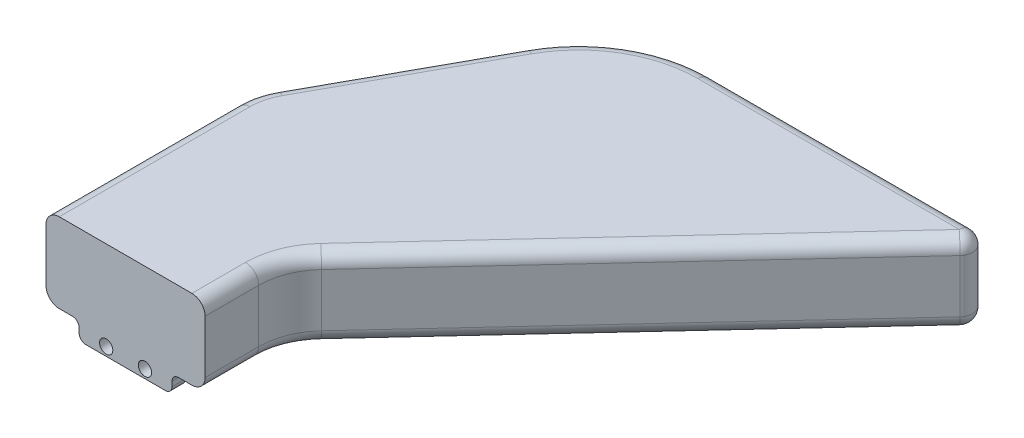
ISO-10303-21;
HEADER;
FILE_DESCRIPTION(('STEP AP214'),'2;1');
FILE_NAME('part.step','',(''),(''),'','','');
FILE_SCHEMA(('AUTOMOTIVE_DESIGN { 1 0 10303 214 1 1 1 1 }'));
ENDSEC;
DATA;
#1=APPLICATION_CONTEXT('core data for automotive mechanical design processes');
#2=APPLICATION_PROTOCOL_DEFINITION('international standard','automotive_design',2000,#1);
#3=PRODUCT_CONTEXT('',#1,'mechanical');
#4=PRODUCT('Part','Part','',(#3));
#5=PRODUCT_RELATED_PRODUCT_CATEGORY('part','',(#4));
#6=PRODUCT_DEFINITION_FORMATION('','',#4);
#7=PRODUCT_DEFINITION_CONTEXT('part definition',#1,'design');
#8=PRODUCT_DEFINITION('design','',#6,#7);
#9=PRODUCT_DEFINITION_SHAPE('','',#8);
#10=(LENGTH_UNIT() NAMED_UNIT(*) SI_UNIT(.MILLI.,.METRE.));
#11=(NAMED_UNIT(*) PLANE_ANGLE_UNIT() SI_UNIT($,.RADIAN.));
#12=(NAMED_UNIT(*) SI_UNIT($,.STERADIAN.) SOLID_ANGLE_UNIT());
#13=UNCERTAINTY_MEASURE_WITH_UNIT(LENGTH_MEASURE(1.E-05),#10,'distance_accuracy_value','');
#14=(GEOMETRIC_REPRESENTATION_CONTEXT(3) GLOBAL_UNCERTAINTY_ASSIGNED_CONTEXT((#13)) GLOBAL_UNIT_ASSIGNED_CONTEXT((#10,
#11,#12)) REPRESENTATION_CONTEXT('',''));
#15=CARTESIAN_POINT('',(0.,0.,0.));
#16=DIRECTION('',(0.,0.,1.));
#17=DIRECTION('',(1.,0.,0.));
#18=AXIS2_PLACEMENT_3D('',#15,#16,#17);
#19=CARTESIAN_POINT('',(-12.,6.,6.));
#20=DIRECTION('',(0.,0.,-1.));
#21=DIRECTION('',(-1.,0.,0.));
#22=AXIS2_PLACEMENT_3D('',#19,#20,#21);
#23=PLANE('',#22);
#24=CARTESIAN_POINT('',(-4.53813912623957,-0.7,6.));
#25=DIRECTION('',(0.,0.,1.));
#26=DIRECTION('',(1.,0.,0.));
#27=AXIS2_PLACEMENT_3D('',#24,#25,#26);
#28=CIRCLE('',#27,0.500000000000001);
#29=CARTESIAN_POINT('',(-4.03813912623957,-0.7,6.));
#30=VERTEX_POINT('',#29);
#31=EDGE_CURVE('E729',#30,#30,#28,.T.);
#32=ORIENTED_EDGE('',*,*,#31,.F.);
#33=EDGE_LOOP('',(#32));
#34=FACE_BOUND('',#33,.T.);
#35=DIRECTION('',(0.,-1.,0.));
#36=VECTOR('',#35,1.);
#37=CARTESIAN_POINT('',(-9.5,0.,6.));
#38=LINE('',#37,#36);
#39=CARTESIAN_POINT('',(-9.5,-0.5,6.));
#40=VERTEX_POINT('',#39);
#41=CARTESIAN_POINT('',(-9.5,-0.85,6.));
#42=VERTEX_POINT('',#41);
#43=EDGE_CURVE('E403',#40,#42,#38,.T.);
#44=ORIENTED_EDGE('',*,*,#43,.T.);
#45=CARTESIAN_POINT('',(-9.,-0.850000000000001,6.));
#46=DIRECTION('',(0.,0.,-1.));
#47=DIRECTION('',(-1.,0.,0.));
#48=AXIS2_PLACEMENT_3D('',#45,#46,#47);
#49=CIRCLE('',#48,0.5);
#50=CARTESIAN_POINT('',(-9.,-1.35,6.));
#51=VERTEX_POINT('',#50);
#52=EDGE_CURVE('E354',#42,#51,#49,.F.);
#53=ORIENTED_EDGE('',*,*,#52,.T.);
#54=DIRECTION('',(1.,0.,0.));
#55=VECTOR('',#54,1.);
#56=CARTESIAN_POINT('',(-9.5,-1.35,6.));
#57=LINE('',#56,#55);
#58=CARTESIAN_POINT('',(-3.,-1.35,6.));
#59=VERTEX_POINT('',#58);
#60=EDGE_CURVE('E410',#51,#59,#57,.T.);
#61=ORIENTED_EDGE('',*,*,#60,.T.);
#62=CARTESIAN_POINT('',(-3.,-0.850000000000001,6.));
#63=DIRECTION('',(0.,0.,-1.));
#64=DIRECTION('',(-1.,0.,0.));
#65=AXIS2_PLACEMENT_3D('',#62,#63,#64);
#66=CIRCLE('',#65,0.5);
#67=CARTESIAN_POINT('',(-2.5,-0.85,6.));
#68=VERTEX_POINT('',#67);
#69=EDGE_CURVE('E352',#59,#68,#66,.F.);
#70=ORIENTED_EDGE('',*,*,#69,.T.);
#71=DIRECTION('',(0.,-1.,0.));
#72=VECTOR('',#71,1.);
#73=CARTESIAN_POINT('',(-2.5,0.,6.));
#74=LINE('',#73,#72);
#75=CARTESIAN_POINT('',(-2.5,-0.5,6.));
#76=VERTEX_POINT('',#75);
#77=EDGE_CURVE('E380',#76,#68,#74,.T.);
#78=ORIENTED_EDGE('',*,*,#77,.F.);
#79=CARTESIAN_POINT('',(-2.,-0.5,6.));
#80=DIRECTION('',(0.,0.,-1.));
#81=DIRECTION('',(-1.,0.,0.));
#82=AXIS2_PLACEMENT_3D('',#79,#80,#81);
#83=CIRCLE('',#82,0.5);
#84=CARTESIAN_POINT('',(-2.,0.,6.));
#85=VERTEX_POINT('',#84);
#86=EDGE_CURVE('E41',#76,#85,#83,.T.);
#87=ORIENTED_EDGE('',*,*,#86,.T.);
#88=DIRECTION('',(1.,0.,0.));
#89=VECTOR('',#88,1.);
#90=CARTESIAN_POINT('',(-12.,0.,6.));
#91=LINE('',#90,#89);
#92=CARTESIAN_POINT('',(-1.,0.,6.));
#93=VERTEX_POINT('',#92);
#94=EDGE_CURVE('E284',#85,#93,#91,.T.);
#95=ORIENTED_EDGE('',*,*,#94,.T.);
#96=CARTESIAN_POINT('',(-1.,1.,6.));
#97=DIRECTION('',(0.,0.,-1.));
#98=DIRECTION('',(-1.,0.,0.));
#99=AXIS2_PLACEMENT_3D('',#96,#97,#98);
#100=CIRCLE('',#99,1.);
#101=CARTESIAN_POINT('',(0.,1.,6.));
#102=VERTEX_POINT('',#101);
#103=EDGE_CURVE('E318',#93,#102,#100,.F.);
#104=ORIENTED_EDGE('',*,*,#103,.T.);
#105=DIRECTION('',(0.,-1.,0.));
#106=VECTOR('',#105,1.);
#107=CARTESIAN_POINT('',(0.,6.,6.));
#108=LINE('',#107,#106);
#109=CARTESIAN_POINT('',(0.,5.,6.));
#110=VERTEX_POINT('',#109);
#111=EDGE_CURVE('E430',#110,#102,#108,.T.);
#112=ORIENTED_EDGE('',*,*,#111,.F.);
#113=CARTESIAN_POINT('',(-1.,5.,6.));
#114=DIRECTION('',(0.,0.,-1.));
#115=DIRECTION('',(-1.,0.,0.));
#116=AXIS2_PLACEMENT_3D('',#113,#114,#115);
#117=CIRCLE('',#116,1.);
#118=CARTESIAN_POINT('',(-1.,6.,6.));
#119=VERTEX_POINT('',#118);
#120=EDGE_CURVE('E231',#110,#119,#117,.F.);
#121=ORIENTED_EDGE('',*,*,#120,.T.);
#122=DIRECTION('',(1.,0.,0.));
#123=VECTOR('',#122,1.);
#124=CARTESIAN_POINT('',(-12.,6.,6.));
#125=LINE('',#124,#123);
#126=CARTESIAN_POINT('',(-11.,6.,6.));
#127=VERTEX_POINT('',#126);
#128=EDGE_CURVE('E213',#127,#119,#125,.T.);
#129=ORIENTED_EDGE('',*,*,#128,.F.);
#130=CARTESIAN_POINT('',(-11.,5.,6.));
#131=DIRECTION('',(0.,0.,-1.));
#132=DIRECTION('',(-1.,0.,0.));
#133=AXIS2_PLACEMENT_3D('',#130,#131,#132);
#134=CIRCLE('',#133,1.);
#135=CARTESIAN_POINT('',(-12.,5.,6.));
#136=VERTEX_POINT('',#135);
#137=EDGE_CURVE('E227',#127,#136,#134,.F.);
#138=ORIENTED_EDGE('',*,*,#137,.T.);
#139=DIRECTION('',(0.,-1.,0.));
#140=VECTOR('',#139,1.);
#141=CARTESIAN_POINT('',(-12.,6.,6.));
#142=LINE('',#141,#140);
#143=CARTESIAN_POINT('',(-12.,1.,6.));
#144=VERTEX_POINT('',#143);
#145=EDGE_CURVE('E433',#136,#144,#142,.T.);
#146=ORIENTED_EDGE('',*,*,#145,.T.);
#147=CARTESIAN_POINT('',(-11.,1.,6.));
#148=DIRECTION('',(0.,0.,-1.));
#149=DIRECTION('',(-1.,0.,0.));
#150=AXIS2_PLACEMENT_3D('',#147,#148,#149);
#151=CIRCLE('',#150,1.);
#152=CARTESIAN_POINT('',(-11.,0.,6.));
#153=VERTEX_POINT('',#152);
#154=EDGE_CURVE('E320',#144,#153,#151,.F.);
#155=ORIENTED_EDGE('',*,*,#154,.T.);
#156=CARTESIAN_POINT('',(-10.,0.,6.));
#157=VERTEX_POINT('',#156);
#158=EDGE_CURVE('E233',#153,#157,#91,.T.);
#159=ORIENTED_EDGE('',*,*,#158,.T.);
#160=CARTESIAN_POINT('',(-10.,-0.5,6.));
#161=DIRECTION('',(0.,0.,-1.));
#162=DIRECTION('',(-1.,0.,0.));
#163=AXIS2_PLACEMENT_3D('',#160,#161,#162);
#164=CIRCLE('',#163,0.5);
#165=EDGE_CURVE('E374',#157,#40,#164,.T.);
#166=ORIENTED_EDGE('',*,*,#165,.T.);
#167=EDGE_LOOP('',(#44,#53,#61,#70,#78,#87,#95,#104,#112,#121,#129,#138,#146,#155,#159,#166));
#168=FACE_BOUND('',#167,.T.);
#169=CARTESIAN_POINT('',(-7.46186087376043,-0.7,6.));
#170=DIRECTION('',(0.,0.,-1.));
#171=DIRECTION('',(-1.,0.,0.));
#172=AXIS2_PLACEMENT_3D('',#169,#170,#171);
#173=CIRCLE('',#172,0.500000000000001);
#174=CARTESIAN_POINT('',(-7.96186087376043,-0.7,6.));
#175=VERTEX_POINT('',#174);
#176=EDGE_CURVE('E730',#175,#175,#173,.T.);
#177=ORIENTED_EDGE('',*,*,#176,.T.);
#178=EDGE_LOOP('',(#177));
#179=FACE_BOUND('',#178,.T.);
#180=ADVANCED_FACE('F33',(#34,#168,#179),#23,.F.);
#181=CARTESIAN_POINT('',(0.,0.,5.));
#182=DIRECTION('',(0.,0.,-1.));
#183=DIRECTION('',(-1.,0.,0.));
#184=AXIS2_PLACEMENT_3D('',#181,#182,#183);
#185=PLANE('',#184);
#186=CARTESIAN_POINT('',(-4.53813912623957,-0.7,5.));
#187=DIRECTION('',(0.,0.,1.));
#188=DIRECTION('',(1.,0.,0.));
#189=AXIS2_PLACEMENT_3D('',#186,#187,#188);
#190=CIRCLE('',#189,0.500000000000001);
#191=CARTESIAN_POINT('',(-4.03813912623957,-0.7,5.));
#192=VERTEX_POINT('',#191);
#193=EDGE_CURVE('E727',#192,#192,#190,.T.);
#194=ORIENTED_EDGE('',*,*,#193,.T.);
#195=EDGE_LOOP('',(#194));
#196=FACE_BOUND('',#195,.T.);
#197=DIRECTION('',(1.,0.,0.));
#198=VECTOR('',#197,1.);
#199=CARTESIAN_POINT('',(-9.5,-1.35,5.));
#200=LINE('',#199,#198);
#201=CARTESIAN_POINT('',(-9.,-1.35,5.));
#202=VERTEX_POINT('',#201);
#203=CARTESIAN_POINT('',(-3.,-1.35,5.));
#204=VERTEX_POINT('',#203);
#205=EDGE_CURVE('E399',#202,#204,#200,.T.);
#206=ORIENTED_EDGE('',*,*,#205,.F.);
#207=CARTESIAN_POINT('',(-9.,-0.850000000000001,5.));
#208=DIRECTION('',(0.,0.,-1.));
#209=DIRECTION('',(-1.,0.,0.));
#210=AXIS2_PLACEMENT_3D('',#207,#208,#209);
#211=CIRCLE('',#210,0.5);
#212=CARTESIAN_POINT('',(-9.5,-0.85,5.));
#213=VERTEX_POINT('',#212);
#214=EDGE_CURVE('E363',#202,#213,#211,.T.);
#215=ORIENTED_EDGE('',*,*,#214,.T.);
#216=DIRECTION('',(0.,-1.,0.));
#217=VECTOR('',#216,1.);
#218=CARTESIAN_POINT('',(-9.5,0.,5.));
#219=LINE('',#218,#217);
#220=CARTESIAN_POINT('',(-9.5,-0.5,5.));
#221=VERTEX_POINT('',#220);
#222=EDGE_CURVE('E328',#221,#213,#219,.T.);
#223=ORIENTED_EDGE('',*,*,#222,.F.);
#224=CARTESIAN_POINT('',(-10.,-0.5,5.));
#225=DIRECTION('',(0.,0.,-1.));
#226=DIRECTION('',(-1.,0.,0.));
#227=AXIS2_PLACEMENT_3D('',#224,#225,#226);
#228=CIRCLE('',#227,0.5);
#229=CARTESIAN_POINT('',(-10.,0.,5.));
#230=VERTEX_POINT('',#229);
#231=EDGE_CURVE('E376',#221,#230,#228,.F.);
#232=ORIENTED_EDGE('',*,*,#231,.T.);
#233=DIRECTION('',(1.,0.,0.));
#234=VECTOR('',#233,1.);
#235=CARTESIAN_POINT('',(-9.5,0.,5.));
#236=LINE('',#235,#234);
#237=CARTESIAN_POINT('',(-2.,0.,5.));
#238=VERTEX_POINT('',#237);
#239=EDGE_CURVE('E48',#230,#238,#236,.T.);
#240=ORIENTED_EDGE('',*,*,#239,.T.);
#241=CARTESIAN_POINT('',(-2.,-0.5,5.));
#242=DIRECTION('',(0.,0.,-1.));
#243=DIRECTION('',(-1.,0.,0.));
#244=AXIS2_PLACEMENT_3D('',#241,#242,#243);
#245=CIRCLE('',#244,0.5);
#246=CARTESIAN_POINT('',(-2.5,-0.5,5.));
#247=VERTEX_POINT('',#246);
#248=EDGE_CURVE('E11',#238,#247,#245,.F.);
#249=ORIENTED_EDGE('',*,*,#248,.T.);
#250=DIRECTION('',(0.,-1.,0.));
#251=VECTOR('',#250,1.);
#252=CARTESIAN_POINT('',(-2.5,0.,5.));
#253=LINE('',#252,#251);
#254=CARTESIAN_POINT('',(-2.5,-0.85,5.));
#255=VERTEX_POINT('',#254);
#256=EDGE_CURVE('E394',#247,#255,#253,.T.);
#257=ORIENTED_EDGE('',*,*,#256,.T.);
#258=CARTESIAN_POINT('',(-3.,-0.850000000000001,5.));
#259=DIRECTION('',(0.,0.,-1.));
#260=DIRECTION('',(-1.,0.,0.));
#261=AXIS2_PLACEMENT_3D('',#258,#259,#260);
#262=CIRCLE('',#261,0.5);
#263=EDGE_CURVE('E361',#255,#204,#262,.T.);
#264=ORIENTED_EDGE('',*,*,#263,.T.);
#265=EDGE_LOOP('',(#206,#215,#223,#232,#240,#249,#257,#264));
#266=FACE_BOUND('',#265,.T.);
#267=CARTESIAN_POINT('',(-7.46186087376043,-0.7,5.));
#268=DIRECTION('',(0.,0.,-1.));
#269=DIRECTION('',(-1.,0.,0.));
#270=AXIS2_PLACEMENT_3D('',#267,#268,#269);
#271=CIRCLE('',#270,0.500000000000001);
#272=CARTESIAN_POINT('',(-7.96186087376043,-0.7,5.));
#273=VERTEX_POINT('',#272);
#274=EDGE_CURVE('E411',#273,#273,#271,.T.);
#275=ORIENTED_EDGE('',*,*,#274,.F.);
#276=EDGE_LOOP('',(#275));
#277=FACE_BOUND('',#276,.T.);
#278=ADVANCED_FACE('F392',(#196,#266,#277),#185,.T.);
#279=CARTESIAN_POINT('',(4.05099434095391,0.,-18.1082033154485));
#280=DIRECTION('',(0.,1.,0.));
#281=DIRECTION('',(0.,0.,1.));
#282=AXIS2_PLACEMENT_3D('',#279,#280,#281);
#283=PLANE('',#282);
#284=ORIENTED_EDGE('',*,*,#239,.F.);
#285=DIRECTION('',(0.,0.,1.));
#286=VECTOR('',#285,1.);
#287=CARTESIAN_POINT('',(-10.,0.,-18.1082033154485));
#288=LINE('',#287,#286);
#289=EDGE_CURVE('E367',#230,#157,#288,.T.);
#290=ORIENTED_EDGE('',*,*,#289,.T.);
#291=ORIENTED_EDGE('',*,*,#158,.F.);
#292=DIRECTION('',(0.,0.,1.));
#293=VECTOR('',#292,1.);
#294=CARTESIAN_POINT('',(-11.,0.,-18.1082033154485));
#295=LINE('',#294,#293);
#296=CARTESIAN_POINT('',(-11.,0.,-8.38318146131155));
#297=VERTEX_POINT('',#296);
#298=EDGE_CURVE('E302',#153,#297,#295,.F.);
#299=ORIENTED_EDGE('',*,*,#298,.T.);
#300=CARTESIAN_POINT('',(-7.,0.,-8.38318146131155));
#301=DIRECTION('',(0.,1.,0.));
#302=DIRECTION('',(0.,0.,1.));
#303=AXIS2_PLACEMENT_3D('',#300,#301,#302);
#304=CIRCLE('',#303,4.);
#305=CARTESIAN_POINT('',(-10.5053665625822,0.,-10.3099417634588));
#306=VERTEX_POINT('',#305);
#307=EDGE_CURVE('E300',#297,#306,#304,.F.);
#308=ORIENTED_EDGE('',*,*,#307,.T.);
#309=DIRECTION('',(-0.481690075536806,0.,0.876341640645557));
#310=VECTOR('',#309,1.);
#311=CARTESIAN_POINT('',(-3.83608042485611,0.,-22.4434139952798));
#312=LINE('',#311,#310);
#313=CARTESIAN_POINT('',(-3.83608042485611,0.,-22.4434139952797));
#314=VERTEX_POINT('',#313);
#315=EDGE_CURVE('E298',#306,#314,#312,.F.);
#316=ORIENTED_EDGE('',*,*,#315,.T.);
#317=CARTESIAN_POINT('',(4.05099434095391,0.,-18.1082033154485));
#318=DIRECTION('',(0.,1.,0.));
#319=DIRECTION('',(0.,0.,1.));
#320=AXIS2_PLACEMENT_3D('',#317,#318,#319);
#321=CIRCLE('',#320,9.);
#322=CARTESIAN_POINT('',(4.05099434095391,0.,-27.1082033154485));
#323=VERTEX_POINT('',#322);
#324=EDGE_CURVE('E296',#314,#323,#321,.F.);
#325=ORIENTED_EDGE('',*,*,#324,.T.);
#326=DIRECTION('',(-1.,0.,0.));
#327=VECTOR('',#326,1.);
#328=CARTESIAN_POINT('',(4.0509943409539,0.,-27.1082033154485));
#329=LINE('',#328,#327);
#330=CARTESIAN_POINT('',(23.7653269040619,0.,-27.1082033154485));
#331=VERTEX_POINT('',#330);
#332=EDGE_CURVE('E294',#323,#331,#329,.F.);
#333=ORIENTED_EDGE('',*,*,#332,.T.);
#334=DIRECTION('',(0.679825964067101,0.,-0.733373478236182));
#335=VECTOR('',#334,1.);
#336=CARTESIAN_POINT('',(10.166988106067,0.,-12.4387709171073));
#337=LINE('',#336,#335);
#338=CARTESIAN_POINT('',(0.59975913058292,0.,-2.11796476716707));
#339=VERTEX_POINT('',#338);
#340=EDGE_CURVE('E292',#331,#339,#337,.F.);
#341=ORIENTED_EDGE('',*,*,#340,.T.);
#342=CARTESIAN_POINT('',(5.,0.,1.96099101723556));
#343=DIRECTION('',(0.,1.,0.));
#344=DIRECTION('',(0.,0.,1.));
#345=AXIS2_PLACEMENT_3D('',#342,#343,#344);
#346=CIRCLE('',#345,6.);
#347=CARTESIAN_POINT('',(-1.,0.,1.96099101723558));
#348=VERTEX_POINT('',#347);
#349=EDGE_CURVE('E290',#339,#348,#346,.T.);
#350=ORIENTED_EDGE('',*,*,#349,.T.);
#351=DIRECTION('',(0.,0.,-1.));
#352=VECTOR('',#351,1.);
#353=CARTESIAN_POINT('',(-1.,0.,-18.1082033154485));
#354=LINE('',#353,#352);
#355=EDGE_CURVE('E287',#348,#93,#354,.F.);
#356=ORIENTED_EDGE('',*,*,#355,.T.);
#357=ORIENTED_EDGE('',*,*,#94,.F.);
#358=DIRECTION('',(0.,0.,1.));
#359=VECTOR('',#358,1.);
#360=CARTESIAN_POINT('',(-2.,0.,5.));
#361=LINE('',#360,#359);
#362=EDGE_CURVE('E365',#85,#238,#361,.F.);
#363=ORIENTED_EDGE('',*,*,#362,.T.);
#364=EDGE_LOOP('',(#284,#290,#291,#299,#308,#316,#325,#333,#341,#350,#356,#357,#363));
#365=FACE_BOUND('',#364,.T.);
#366=ADVANCED_FACE('F384',(#365),#283,.F.);
#367=CARTESIAN_POINT('',(4.05099434095391,6.,-18.1082033154485));
#368=DIRECTION('',(0.,-1.,0.));
#369=DIRECTION('',(0.,0.,-1.));
#370=AXIS2_PLACEMENT_3D('',#367,#368,#369);
#371=CYLINDRICAL_SURFACE('',#370,10.);
#372=DIRECTION('',(0.,-1.,0.));
#373=VECTOR('',#372,1.);
#374=CARTESIAN_POINT('',(4.05099434095391,6.,-28.1082033154485));
#375=LINE('',#374,#373);
#376=CARTESIAN_POINT('',(4.05099434095391,5.,-28.1082033154485));
#377=VERTEX_POINT('',#376);
#378=CARTESIAN_POINT('',(4.05099434095391,1.,-28.1082033154485));
#379=VERTEX_POINT('',#378);
#380=EDGE_CURVE('E232',#377,#379,#375,.T.);
#381=ORIENTED_EDGE('',*,*,#380,.T.);
#382=CARTESIAN_POINT('',(4.05099434095391,1.,-18.1082033154485));
#383=DIRECTION('',(0.,1.,0.));
#384=DIRECTION('',(0.,0.,1.));
#385=AXIS2_PLACEMENT_3D('',#382,#383,#384);
#386=CIRCLE('',#385,10.);
#387=CARTESIAN_POINT('',(-4.71242206550166,1.,-22.9251040708166));
#388=VERTEX_POINT('',#387);
#389=EDGE_CURVE('E306',#379,#388,#386,.T.);
#390=ORIENTED_EDGE('',*,*,#389,.T.);
#391=DIRECTION('',(0.,-1.,0.));
#392=VECTOR('',#391,1.);
#393=CARTESIAN_POINT('',(-4.71242206550166,6.,-22.9251040708166));
#394=LINE('',#393,#392);
#395=CARTESIAN_POINT('',(-4.71242206550166,5.,-22.9251040708166));
#396=VERTEX_POINT('',#395);
#397=EDGE_CURVE('E221',#396,#388,#394,.T.);
#398=ORIENTED_EDGE('',*,*,#397,.F.);
#399=CARTESIAN_POINT('',(4.05099434095391,5.,-18.1082033154485));
#400=DIRECTION('',(0.,1.,0.));
#401=DIRECTION('',(0.,0.,1.));
#402=AXIS2_PLACEMENT_3D('',#399,#400,#401);
#403=CIRCLE('',#402,10.);
#404=EDGE_CURVE('E253',#396,#377,#403,.F.);
#405=ORIENTED_EDGE('',*,*,#404,.T.);
#406=EDGE_LOOP('',(#381,#390,#398,#405));
#407=FACE_BOUND('',#406,.T.);
#408=ADVANCED_FACE('F584',(#407),#371,.T.);
#409=CARTESIAN_POINT('',(-11.3817082032278,6.,-10.7916318389956));
#410=DIRECTION('',(0.876341640645557,0.,0.481690075536806));
#411=DIRECTION('',(0.481690075536806,0.,-0.876341640645557));
#412=AXIS2_PLACEMENT_3D('',#409,#410,#411);
#413=PLANE('',#412);
#414=ORIENTED_EDGE('',*,*,#397,.T.);
#415=DIRECTION('',(-0.481690075536806,0.,0.876341640645557));
#416=VECTOR('',#415,1.);
#417=CARTESIAN_POINT('',(-11.3817082032278,1.,-10.7916318389956));
#418=LINE('',#417,#416);
#419=CARTESIAN_POINT('',(-11.3817082032278,1.,-10.7916318389956));
#420=VERTEX_POINT('',#419);
#421=EDGE_CURVE('E304',#388,#420,#418,.T.);
#422=ORIENTED_EDGE('',*,*,#421,.T.);
#423=DIRECTION('',(0.,-1.,0.));
#424=VECTOR('',#423,1.);
#425=CARTESIAN_POINT('',(-11.3817082032278,6.,-10.7916318389956));
#426=LINE('',#425,#424);
#427=CARTESIAN_POINT('',(-11.3817082032278,5.,-10.7916318389956));
#428=VERTEX_POINT('',#427);
#429=EDGE_CURVE('E438',#428,#420,#426,.T.);
#430=ORIENTED_EDGE('',*,*,#429,.F.);
#431=DIRECTION('',(-0.481690075536806,0.,0.876341640645557));
#432=VECTOR('',#431,1.);
#433=CARTESIAN_POINT('',(-4.71242206550166,5.,-22.9251040708166));
#434=LINE('',#433,#432);
#435=EDGE_CURVE('E255',#428,#396,#434,.F.);
#436=ORIENTED_EDGE('',*,*,#435,.T.);
#437=EDGE_LOOP('',(#414,#422,#430,#436));
#438=FACE_BOUND('',#437,.T.);
#439=ADVANCED_FACE('F518',(#438),#413,.F.);
#440=CARTESIAN_POINT('',(-7.,6.,-8.38318146131155));
#441=DIRECTION('',(0.,-1.,0.));
#442=DIRECTION('',(0.,0.,-1.));
#443=AXIS2_PLACEMENT_3D('',#440,#441,#442);
#444=CYLINDRICAL_SURFACE('',#443,5.);
#445=ORIENTED_EDGE('',*,*,#429,.T.);
#446=CARTESIAN_POINT('',(-7.,1.,-8.38318146131155));
#447=DIRECTION('',(0.,1.,0.));
#448=DIRECTION('',(0.,0.,1.));
#449=AXIS2_PLACEMENT_3D('',#446,#447,#448);
#450=CIRCLE('',#449,5.);
#451=CARTESIAN_POINT('',(-12.,1.,-8.38318146131155));
#452=VERTEX_POINT('',#451);
#453=EDGE_CURVE('E260',#420,#452,#450,.T.);
#454=ORIENTED_EDGE('',*,*,#453,.T.);
#455=DIRECTION('',(0.,-1.,0.));
#456=VECTOR('',#455,1.);
#457=CARTESIAN_POINT('',(-12.,6.,-8.38318146131155));
#458=LINE('',#457,#456);
#459=CARTESIAN_POINT('',(-12.,5.,-8.38318146131155));
#460=VERTEX_POINT('',#459);
#461=EDGE_CURVE('E435',#460,#452,#458,.T.);
#462=ORIENTED_EDGE('',*,*,#461,.F.);
#463=CARTESIAN_POINT('',(-7.,5.,-8.38318146131155));
#464=DIRECTION('',(0.,1.,0.));
#465=DIRECTION('',(0.,0.,1.));
#466=AXIS2_PLACEMENT_3D('',#463,#464,#465);
#467=CIRCLE('',#466,5.);
#468=EDGE_CURVE('E257',#460,#428,#467,.F.);
#469=ORIENTED_EDGE('',*,*,#468,.T.);
#470=EDGE_LOOP('',(#445,#454,#462,#469));
#471=FACE_BOUND('',#470,.T.);
#472=ADVANCED_FACE('F515',(#471),#444,.T.);
#473=CARTESIAN_POINT('',(-12.,6.,-8.38318146131155));
#474=DIRECTION('',(1.,0.,0.));
#475=DIRECTION('',(0.,0.,-1.));
#476=AXIS2_PLACEMENT_3D('',#473,#474,#475);
#477=PLANE('',#476);
#478=ORIENTED_EDGE('',*,*,#461,.T.);
#479=DIRECTION('',(0.,0.,1.));
#480=VECTOR('',#479,1.);
#481=CARTESIAN_POINT('',(-12.,1.,-8.38318146131155));
#482=LINE('',#481,#480);
#483=EDGE_CURVE('E316',#452,#144,#482,.T.);
#484=ORIENTED_EDGE('',*,*,#483,.T.);
#485=ORIENTED_EDGE('',*,*,#145,.F.);
#486=DIRECTION('',(0.,0.,1.));
#487=VECTOR('',#486,1.);
#488=CARTESIAN_POINT('',(-12.,5.,-8.38318146131155));
#489=LINE('',#488,#487);
#490=EDGE_CURVE('E237',#136,#460,#489,.F.);
#491=ORIENTED_EDGE('',*,*,#490,.T.);
#492=EDGE_LOOP('',(#478,#484,#485,#491));
#493=FACE_BOUND('',#492,.T.);
#494=ADVANCED_FACE('F532',(#493),#477,.F.);
#495=CARTESIAN_POINT('',(0.,6.,6.));
#496=DIRECTION('',(-1.,0.,0.));
#497=DIRECTION('',(0.,0.,1.));
#498=AXIS2_PLACEMENT_3D('',#495,#496,#497);
#499=PLANE('',#498);
#500=ORIENTED_EDGE('',*,*,#111,.T.);
#501=DIRECTION('',(0.,0.,-1.));
#502=VECTOR('',#501,1.);
#503=CARTESIAN_POINT('',(0.,1.,6.));
#504=LINE('',#503,#502);
#505=CARTESIAN_POINT('',(0.,1.,1.96099101723557));
#506=VERTEX_POINT('',#505);
#507=EDGE_CURVE('E322',#102,#506,#504,.T.);
#508=ORIENTED_EDGE('',*,*,#507,.T.);
#509=DIRECTION('',(0.,-1.,0.));
#510=VECTOR('',#509,1.);
#511=CARTESIAN_POINT('',(0.,6.,1.96099101723557));
#512=LINE('',#511,#510);
#513=CARTESIAN_POINT('',(0.,5.,1.96099101723557));
#514=VERTEX_POINT('',#513);
#515=EDGE_CURVE('E427',#514,#506,#512,.T.);
#516=ORIENTED_EDGE('',*,*,#515,.F.);
#517=DIRECTION('',(0.,0.,-1.));
#518=VECTOR('',#517,1.);
#519=CARTESIAN_POINT('',(0.,5.,6.));
#520=LINE('',#519,#518);
#521=EDGE_CURVE('E238',#514,#110,#520,.F.);
#522=ORIENTED_EDGE('',*,*,#521,.T.);
#523=EDGE_LOOP('',(#500,#508,#516,#522));
#524=FACE_BOUND('',#523,.T.);
#525=ADVANCED_FACE('F576',(#524),#499,.F.);
#526=CARTESIAN_POINT('',(5.,6.,1.96099101723556));
#527=DIRECTION('',(0.,-1.,0.));
#528=DIRECTION('',(0.,0.,-1.));
#529=AXIS2_PLACEMENT_3D('',#526,#527,#528);
#530=CYLINDRICAL_SURFACE('',#529,5.);
#531=ORIENTED_EDGE('',*,*,#515,.T.);
#532=CARTESIAN_POINT('',(5.,1.,1.96099101723556));
#533=DIRECTION('',(0.,1.,0.));
#534=DIRECTION('',(0.,0.,1.));
#535=AXIS2_PLACEMENT_3D('',#532,#533,#534);
#536=CIRCLE('',#535,5.);
#537=CARTESIAN_POINT('',(1.3331326088191,1.,-1.43813880309996));
#538=VERTEX_POINT('',#537);
#539=EDGE_CURVE('E314',#506,#538,#536,.F.);
#540=ORIENTED_EDGE('',*,*,#539,.T.);
#541=DIRECTION('',(0.,-1.,0.));
#542=VECTOR('',#541,1.);
#543=CARTESIAN_POINT('',(1.3331326088191,6.,-1.43813880309996));
#544=LINE('',#543,#542);
#545=CARTESIAN_POINT('',(1.3331326088191,5.,-1.43813880309996));
#546=VERTEX_POINT('',#545);
#547=EDGE_CURVE('E424',#546,#538,#544,.T.);
#548=ORIENTED_EDGE('',*,*,#547,.F.);
#549=CARTESIAN_POINT('',(5.,5.,1.96099101723556));
#550=DIRECTION('',(0.,1.,0.));
#551=DIRECTION('',(0.,0.,1.));
#552=AXIS2_PLACEMENT_3D('',#549,#550,#551);
#553=CIRCLE('',#552,5.);
#554=EDGE_CURVE('E240',#546,#514,#553,.T.);
#555=ORIENTED_EDGE('',*,*,#554,.T.);
#556=EDGE_LOOP('',(#531,#540,#548,#555));
#557=FACE_BOUND('',#556,.T.);
#558=ADVANCED_FACE('F653',(#557),#530,.F.);
#559=CARTESIAN_POINT('',(24.4987003822981,6.,-26.4283773513814));
#560=DIRECTION('',(-0.733373478236182,0.,-0.679825964067101));
#561=DIRECTION('',(-0.679825964067101,0.,0.733373478236182));
#562=AXIS2_PLACEMENT_3D('',#559,#560,#561);
#563=PLANE('',#562);
#564=ORIENTED_EDGE('',*,*,#547,.T.);
#565=DIRECTION('',(0.679825964067101,0.,-0.733373478236182));
#566=VECTOR('',#565,1.);
#567=CARTESIAN_POINT('',(24.4987003822981,1.,-26.4283773513814));
#568=LINE('',#567,#566);
#569=CARTESIAN_POINT('',(24.4987003822981,1.,-26.4283773513814));
#570=VERTEX_POINT('',#569);
#571=EDGE_CURVE('E312',#538,#570,#568,.T.);
#572=ORIENTED_EDGE('',*,*,#571,.T.);
#573=DIRECTION('',(0.,-1.,0.));
#574=VECTOR('',#573,1.);
#575=CARTESIAN_POINT('',(24.4987003822981,6.,-26.4283773513814));
#576=LINE('',#575,#574);
#577=CARTESIAN_POINT('',(24.4987003822981,5.,-26.4283773513814));
#578=VERTEX_POINT('',#577);
#579=EDGE_CURVE('E421',#578,#570,#576,.T.);
#580=ORIENTED_EDGE('',*,*,#579,.F.);
#581=DIRECTION('',(0.679825964067101,0.,-0.733373478236182));
#582=VECTOR('',#581,1.);
#583=CARTESIAN_POINT('',(1.33313260881911,5.,-1.43813880309997));
#584=LINE('',#583,#582);
#585=EDGE_CURVE('E247',#578,#546,#584,.F.);
#586=ORIENTED_EDGE('',*,*,#585,.T.);
#587=EDGE_LOOP('',(#564,#572,#580,#586));
#588=FACE_BOUND('',#587,.T.);
#589=ADVANCED_FACE('F483',(#588),#563,.F.);
#590=CARTESIAN_POINT('',(23.7653269040619,6.,-27.1082033154485));
#591=DIRECTION('',(0.,-1.,0.));
#592=DIRECTION('',(0.,0.,-1.));
#593=AXIS2_PLACEMENT_3D('',#590,#591,#592);
#594=CYLINDRICAL_SURFACE('',#593,1.);
#595=ORIENTED_EDGE('',*,*,#579,.T.);
#596=CARTESIAN_POINT('',(23.7653269040619,1.,-27.1082033154485));
#597=DIRECTION('',(0.,-1.,0.));
#598=DIRECTION('',(0.,0.,-1.));
#599=AXIS2_PLACEMENT_3D('',#596,#597,#598);
#600=CIRCLE('',#599,1.);
#601=CARTESIAN_POINT('',(23.7653269040619,1.,-28.1082033154485));
#602=VERTEX_POINT('',#601);
#603=EDGE_CURVE('E310',#570,#602,#600,.F.);
#604=ORIENTED_EDGE('',*,*,#603,.T.);
#605=DIRECTION('',(0.,-1.,0.));
#606=VECTOR('',#605,1.);
#607=CARTESIAN_POINT('',(23.7653269040619,6.,-28.1082033154485));
#608=LINE('',#607,#606);
#609=CARTESIAN_POINT('',(23.7653269040619,5.,-28.1082033154485));
#610=VERTEX_POINT('',#609);
#611=EDGE_CURVE('E418',#610,#602,#608,.T.);
#612=ORIENTED_EDGE('',*,*,#611,.F.);
#613=CARTESIAN_POINT('',(23.7653269040619,5.,-27.1082033154485));
#614=DIRECTION('',(0.,-1.,0.));
#615=DIRECTION('',(0.,0.,-1.));
#616=AXIS2_PLACEMENT_3D('',#613,#614,#615);
#617=CIRCLE('',#616,1.);
#618=EDGE_CURVE('E249',#610,#578,#617,.T.);
#619=ORIENTED_EDGE('',*,*,#618,.T.);
#620=EDGE_LOOP('',(#595,#604,#612,#619));
#621=FACE_BOUND('',#620,.T.);
#622=ADVANCED_FACE('F480',(#621),#594,.T.);
#623=CARTESIAN_POINT('',(4.05099434095391,6.,-28.1082033154485));
#624=DIRECTION('',(0.,0.,1.));
#625=DIRECTION('',(1.,0.,0.));
#626=AXIS2_PLACEMENT_3D('',#623,#624,#625);
#627=PLANE('',#626);
#628=ORIENTED_EDGE('',*,*,#611,.T.);
#629=DIRECTION('',(-1.,0.,0.));
#630=VECTOR('',#629,1.);
#631=CARTESIAN_POINT('',(4.05099434095391,1.,-28.1082033154485));
#632=LINE('',#631,#630);
#633=EDGE_CURVE('E308',#602,#379,#632,.T.);
#634=ORIENTED_EDGE('',*,*,#633,.T.);
#635=ORIENTED_EDGE('',*,*,#380,.F.);
#636=DIRECTION('',(-1.,0.,0.));
#637=VECTOR('',#636,1.);
#638=CARTESIAN_POINT('',(23.7653269040619,5.,-28.1082033154485));
#639=LINE('',#638,#637);
#640=EDGE_CURVE('E251',#377,#610,#639,.F.);
#641=ORIENTED_EDGE('',*,*,#640,.T.);
#642=EDGE_LOOP('',(#628,#634,#635,#641));
#643=FACE_BOUND('',#642,.T.);
#644=ADVANCED_FACE('F496',(#643),#627,.F.);
#645=CARTESIAN_POINT('',(4.05099434095391,6.,-18.1082033154485));
#646=DIRECTION('',(0.,1.,0.));
#647=DIRECTION('',(0.,0.,1.));
#648=AXIS2_PLACEMENT_3D('',#645,#646,#647);
#649=PLANE('',#648);
#650=ORIENTED_EDGE('',*,*,#128,.T.);
#651=DIRECTION('',(0.,0.,-1.));
#652=VECTOR('',#651,1.);
#653=CARTESIAN_POINT('',(-1.,6.,1.96099101723558));
#654=LINE('',#653,#652);
#655=CARTESIAN_POINT('',(-1.,6.,1.96099101723557));
#656=VERTEX_POINT('',#655);
#657=EDGE_CURVE('E242',#119,#656,#654,.T.);
#658=ORIENTED_EDGE('',*,*,#657,.T.);
#659=CARTESIAN_POINT('',(5.,6.,1.96099101723556));
#660=DIRECTION('',(0.,1.,0.));
#661=DIRECTION('',(0.,0.,1.));
#662=AXIS2_PLACEMENT_3D('',#659,#660,#661);
#663=CIRCLE('',#662,6.);
#664=CARTESIAN_POINT('',(0.599759130582923,6.,-2.11796476716707));
#665=VERTEX_POINT('',#664);
#666=EDGE_CURVE('E452',#656,#665,#663,.F.);
#667=ORIENTED_EDGE('',*,*,#666,.T.);
#668=DIRECTION('',(0.679825964067101,0.,-0.733373478236182));
#669=VECTOR('',#668,1.);
#670=CARTESIAN_POINT('',(23.7653269040619,6.,-27.1082033154485));
#671=LINE('',#670,#669);
#672=CARTESIAN_POINT('',(23.7653269040619,6.,-27.1082033154485));
#673=VERTEX_POINT('',#672);
#674=EDGE_CURVE('E450',#665,#673,#671,.T.);
#675=ORIENTED_EDGE('',*,*,#674,.T.);
#676=DIRECTION('',(-1.,0.,0.));
#677=VECTOR('',#676,1.);
#678=CARTESIAN_POINT('',(4.05099434095391,6.,-27.1082033154485));
#679=LINE('',#678,#677);
#680=CARTESIAN_POINT('',(4.05099434095391,6.,-27.1082033154485));
#681=VERTEX_POINT('',#680);
#682=EDGE_CURVE('E448',#673,#681,#679,.T.);
#683=ORIENTED_EDGE('',*,*,#682,.T.);
#684=CARTESIAN_POINT('',(4.05099434095391,6.,-18.1082033154485));
#685=DIRECTION('',(0.,1.,0.));
#686=DIRECTION('',(0.,0.,1.));
#687=AXIS2_PLACEMENT_3D('',#684,#685,#686);
#688=CIRCLE('',#687,9.);
#689=CARTESIAN_POINT('',(-3.83608042485611,6.,-22.4434139952797));
#690=VERTEX_POINT('',#689);
#691=EDGE_CURVE('E446',#681,#690,#688,.T.);
#692=ORIENTED_EDGE('',*,*,#691,.T.);
#693=DIRECTION('',(-0.481690075536806,0.,0.876341640645557));
#694=VECTOR('',#693,1.);
#695=CARTESIAN_POINT('',(-10.5053665625822,6.,-10.3099417634588));
#696=LINE('',#695,#694);
#697=CARTESIAN_POINT('',(-10.5053665625822,6.,-10.3099417634588));
#698=VERTEX_POINT('',#697);
#699=EDGE_CURVE('E444',#690,#698,#696,.T.);
#700=ORIENTED_EDGE('',*,*,#699,.T.);
#701=CARTESIAN_POINT('',(-7.,6.,-8.38318146131155));
#702=DIRECTION('',(0.,1.,0.));
#703=DIRECTION('',(0.,0.,1.));
#704=AXIS2_PLACEMENT_3D('',#701,#702,#703);
#705=CIRCLE('',#704,4.);
#706=CARTESIAN_POINT('',(-11.,6.,-8.38318146131155));
#707=VERTEX_POINT('',#706);
#708=EDGE_CURVE('E216',#698,#707,#705,.T.);
#709=ORIENTED_EDGE('',*,*,#708,.T.);
#710=DIRECTION('',(0.,0.,1.));
#711=VECTOR('',#710,1.);
#712=CARTESIAN_POINT('',(-11.,6.,6.));
#713=LINE('',#712,#711);
#714=EDGE_CURVE('E209',#707,#127,#713,.T.);
#715=ORIENTED_EDGE('',*,*,#714,.T.);
#716=EDGE_LOOP('',(#650,#658,#667,#675,#683,#692,#700,#709,#715));
#717=FACE_BOUND('',#716,.T.);
#718=ADVANCED_FACE('F211',(#717),#649,.T.);
#719=CARTESIAN_POINT('',(-11.,5.,-18.1082033154485));
#720=DIRECTION('',(0.,0.,-1.));
#721=DIRECTION('',(-1.,0.,0.));
#722=AXIS2_PLACEMENT_3D('',#719,#720,#721);
#723=CYLINDRICAL_SURFACE('',#722,1.);
#724=ORIENTED_EDGE('',*,*,#137,.F.);
#725=ORIENTED_EDGE('',*,*,#714,.F.);
#726=CARTESIAN_POINT('',(-11.,5.,-8.38318146131155));
#727=DIRECTION('',(0.,0.,-1.));
#728=DIRECTION('',(-1.,0.,0.));
#729=AXIS2_PLACEMENT_3D('',#726,#727,#728);
#730=CIRCLE('',#729,1.);
#731=EDGE_CURVE('E282',#460,#707,#730,.T.);
#732=ORIENTED_EDGE('',*,*,#731,.F.);
#733=ORIENTED_EDGE('',*,*,#490,.F.);
#734=EDGE_LOOP('',(#724,#725,#732,#733));
#735=FACE_BOUND('',#734,.T.);
#736=ADVANCED_FACE('F236',(#735),#723,.T.);
#737=CARTESIAN_POINT('',(-7.,5.,-8.38318146131155));
#738=DIRECTION('',(0.,1.,0.));
#739=DIRECTION('',(0.,0.,1.));
#740=AXIS2_PLACEMENT_3D('',#737,#738,#739);
#741=TOROIDAL_SURFACE('',#740,4.,1.);
#742=ORIENTED_EDGE('',*,*,#731,.T.);
#743=ORIENTED_EDGE('',*,*,#708,.F.);
#744=CARTESIAN_POINT('',(-10.5053665625822,5.,-10.3099417634588));
#745=DIRECTION('',(0.481690075536806,0.,-0.876341640645557));
#746=DIRECTION('',(-0.876341640645557,0.,-0.481690075536806));
#747=AXIS2_PLACEMENT_3D('',#744,#745,#746);
#748=CIRCLE('',#747,1.);
#749=EDGE_CURVE('E279',#428,#698,#748,.T.);
#750=ORIENTED_EDGE('',*,*,#749,.F.);
#751=ORIENTED_EDGE('',*,*,#468,.F.);
#752=EDGE_LOOP('',(#742,#743,#750,#751));
#753=FACE_BOUND('',#752,.T.);
#754=ADVANCED_FACE('F511',(#753),#741,.T.);
#755=CARTESIAN_POINT('',(-3.83608042485611,5.,-22.4434139952798));
#756=DIRECTION('',(0.481690075536806,0.,-0.876341640645557));
#757=DIRECTION('',(-0.876341640645557,0.,-0.481690075536806));
#758=AXIS2_PLACEMENT_3D('',#755,#756,#757);
#759=CYLINDRICAL_SURFACE('',#758,1.);
#760=ORIENTED_EDGE('',*,*,#749,.T.);
#761=ORIENTED_EDGE('',*,*,#699,.F.);
#762=CARTESIAN_POINT('',(-3.8360804248561,5.,-22.4434139952797));
#763=DIRECTION('',(0.481690075536806,0.,-0.876341640645557));
#764=DIRECTION('',(-0.876341640645557,0.,-0.481690075536806));
#765=AXIS2_PLACEMENT_3D('',#762,#763,#764);
#766=CIRCLE('',#765,1.);
#767=EDGE_CURVE('E276',#396,#690,#766,.T.);
#768=ORIENTED_EDGE('',*,*,#767,.F.);
#769=ORIENTED_EDGE('',*,*,#435,.F.);
#770=EDGE_LOOP('',(#760,#761,#768,#769));
#771=FACE_BOUND('',#770,.T.);
#772=ADVANCED_FACE('F506',(#771),#759,.T.);
#773=CARTESIAN_POINT('',(4.05099434095391,5.,-18.1082033154485));
#774=DIRECTION('',(0.,1.,0.));
#775=DIRECTION('',(0.,0.,1.));
#776=AXIS2_PLACEMENT_3D('',#773,#774,#775);
#777=TOROIDAL_SURFACE('',#776,9.,1.);
#778=ORIENTED_EDGE('',*,*,#767,.T.);
#779=ORIENTED_EDGE('',*,*,#691,.F.);
#780=CARTESIAN_POINT('',(4.05099434095391,5.,-27.1082033154485));
#781=DIRECTION('',(1.,0.,0.));
#782=DIRECTION('',(0.,0.,-1.));
#783=AXIS2_PLACEMENT_3D('',#780,#781,#782);
#784=CIRCLE('',#783,1.);
#785=EDGE_CURVE('E273',#377,#681,#784,.T.);
#786=ORIENTED_EDGE('',*,*,#785,.F.);
#787=ORIENTED_EDGE('',*,*,#404,.F.);
#788=EDGE_LOOP('',(#778,#779,#786,#787));
#789=FACE_BOUND('',#788,.T.);
#790=ADVANCED_FACE('F502',(#789),#777,.T.);
#791=CARTESIAN_POINT('',(4.0509943409539,5.,-27.1082033154485));
#792=DIRECTION('',(1.,0.,0.));
#793=DIRECTION('',(0.,0.,-1.));
#794=AXIS2_PLACEMENT_3D('',#791,#792,#793);
#795=CYLINDRICAL_SURFACE('',#794,1.);
#796=CARTESIAN_POINT('',(23.7653269040619,5.,-27.1082033154485));
#797=DIRECTION('',(1.,0.,0.));
#798=DIRECTION('',(0.,0.,-1.));
#799=AXIS2_PLACEMENT_3D('',#796,#797,#798);
#800=CIRCLE('',#799,1.);
#801=EDGE_CURVE('E270',#610,#673,#800,.T.);
#802=ORIENTED_EDGE('',*,*,#801,.F.);
#803=ORIENTED_EDGE('',*,*,#640,.F.);
#804=ORIENTED_EDGE('',*,*,#785,.T.);
#805=ORIENTED_EDGE('',*,*,#682,.F.);
#806=EDGE_LOOP('',(#802,#803,#804,#805));
#807=FACE_BOUND('',#806,.T.);
#808=ADVANCED_FACE('F471',(#807),#795,.T.);
#809=CARTESIAN_POINT('',(23.7653269040619,5.,-27.1082033154485));
#810=DIRECTION('',(0.,0.,1.));
#811=DIRECTION('',(1.,0.,0.));
#812=AXIS2_PLACEMENT_3D('',#809,#810,#811);
#813=SPHERICAL_SURFACE('',#812,1.);
#814=ORIENTED_EDGE('',*,*,#618,.F.);
#815=ORIENTED_EDGE('',*,*,#801,.T.);
#816=CARTESIAN_POINT('',(23.7653269040619,5.,-27.1082033154485));
#817=DIRECTION('',(-0.679825964067102,0.,0.733373478236182));
#818=DIRECTION('',(0.733373478236182,0.,0.679825964067102));
#819=AXIS2_PLACEMENT_3D('',#816,#817,#818);
#820=CIRCLE('',#819,1.);
#821=EDGE_CURVE('E267',#578,#673,#820,.T.);
#822=ORIENTED_EDGE('',*,*,#821,.F.);
#823=EDGE_LOOP('',(#814,#815,#822));
#824=FACE_BOUND('',#823,.T.);
#825=ADVANCED_FACE('F476',(#824),#813,.T.);
#826=CARTESIAN_POINT('',(10.166988106067,5.,-12.4387709171073));
#827=DIRECTION('',(-0.679825964067101,0.,0.733373478236182));
#828=DIRECTION('',(0.733373478236182,0.,0.679825964067101));
#829=AXIS2_PLACEMENT_3D('',#826,#827,#828);
#830=CYLINDRICAL_SURFACE('',#829,1.);
#831=ORIENTED_EDGE('',*,*,#821,.T.);
#832=ORIENTED_EDGE('',*,*,#674,.F.);
#833=CARTESIAN_POINT('',(0.59975913058292,5.,-2.11796476716707));
#834=DIRECTION('',(-0.679825964067101,0.,0.733373478236182));
#835=DIRECTION('',(0.733373478236182,0.,0.679825964067101));
#836=AXIS2_PLACEMENT_3D('',#833,#834,#835);
#837=CIRCLE('',#836,1.);
#838=EDGE_CURVE('E263',#546,#665,#837,.T.);
#839=ORIENTED_EDGE('',*,*,#838,.F.);
#840=ORIENTED_EDGE('',*,*,#585,.F.);
#841=EDGE_LOOP('',(#831,#832,#839,#840));
#842=FACE_BOUND('',#841,.T.);
#843=ADVANCED_FACE('F465',(#842),#830,.T.);
#844=CARTESIAN_POINT('',(5.,5.,1.96099101723556));
#845=DIRECTION('',(0.,1.,0.));
#846=DIRECTION('',(0.,0.,1.));
#847=AXIS2_PLACEMENT_3D('',#844,#845,#846);
#848=TOROIDAL_SURFACE('',#847,6.,1.);
#849=ORIENTED_EDGE('',*,*,#838,.T.);
#850=ORIENTED_EDGE('',*,*,#666,.F.);
#851=CARTESIAN_POINT('',(-1.,5.,1.96099101723558));
#852=DIRECTION('',(0.,0.,1.));
#853=DIRECTION('',(1.,0.,0.));
#854=AXIS2_PLACEMENT_3D('',#851,#852,#853);
#855=CIRCLE('',#854,1.);
#856=EDGE_CURVE('E261',#514,#656,#855,.T.);
#857=ORIENTED_EDGE('',*,*,#856,.F.);
#858=ORIENTED_EDGE('',*,*,#554,.F.);
#859=EDGE_LOOP('',(#849,#850,#857,#858));
#860=FACE_BOUND('',#859,.T.);
#861=ADVANCED_FACE('F461',(#860),#848,.T.);
#862=CARTESIAN_POINT('',(-1.,5.,-18.1082033154485));
#863=DIRECTION('',(0.,0.,1.));
#864=DIRECTION('',(1.,0.,0.));
#865=AXIS2_PLACEMENT_3D('',#862,#863,#864);
#866=CYLINDRICAL_SURFACE('',#865,1.);
#867=ORIENTED_EDGE('',*,*,#120,.F.);
#868=ORIENTED_EDGE('',*,*,#521,.F.);
#869=ORIENTED_EDGE('',*,*,#856,.T.);
#870=ORIENTED_EDGE('',*,*,#657,.F.);
#871=EDGE_LOOP('',(#867,#868,#869,#870));
#872=FACE_BOUND('',#871,.T.);
#873=ADVANCED_FACE('F456',(#872),#866,.T.);
#874=CARTESIAN_POINT('',(-1.,1.,6.));
#875=DIRECTION('',(0.,0.,-1.));
#876=DIRECTION('',(-1.,0.,0.));
#877=AXIS2_PLACEMENT_3D('',#874,#875,#876);
#878=CYLINDRICAL_SURFACE('',#877,1.);
#879=ORIENTED_EDGE('',*,*,#103,.F.);
#880=ORIENTED_EDGE('',*,*,#355,.F.);
#881=CARTESIAN_POINT('',(-1.,1.,1.96099101723557));
#882=DIRECTION('',(0.,0.,-1.));
#883=DIRECTION('',(0.,1.,0.));
#884=AXIS2_PLACEMENT_3D('',#881,#882,#883);
#885=CIRCLE('',#884,1.);
#886=EDGE_CURVE('E264',#506,#348,#885,.T.);
#887=ORIENTED_EDGE('',*,*,#886,.F.);
#888=ORIENTED_EDGE('',*,*,#507,.F.);
#889=EDGE_LOOP('',(#879,#880,#887,#888));
#890=FACE_BOUND('',#889,.T.);
#891=ADVANCED_FACE('F589',(#890),#878,.T.);
#892=CARTESIAN_POINT('',(5.,1.,1.96099101723556));
#893=DIRECTION('',(0.,1.,0.));
#894=DIRECTION('',(0.,0.,1.));
#895=AXIS2_PLACEMENT_3D('',#892,#893,#894);
#896=TOROIDAL_SURFACE('',#895,6.,1.);
#897=ORIENTED_EDGE('',*,*,#886,.T.);
#898=ORIENTED_EDGE('',*,*,#349,.F.);
#899=CARTESIAN_POINT('',(0.599759130582923,1.,-2.11796476716707));
#900=DIRECTION('',(0.679825964067104,0.,-0.73337347823618));
#901=DIRECTION('',(-0.73337347823618,0.,-0.679825964067104));
#902=AXIS2_PLACEMENT_3D('',#899,#900,#901);
#903=CIRCLE('',#902,1.);
#904=EDGE_CURVE('E343',#538,#339,#903,.T.);
#905=ORIENTED_EDGE('',*,*,#904,.F.);
#906=ORIENTED_EDGE('',*,*,#539,.F.);
#907=EDGE_LOOP('',(#897,#898,#905,#906));
#908=FACE_BOUND('',#907,.T.);
#909=ADVANCED_FACE('F624',(#908),#896,.T.);
#910=CARTESIAN_POINT('',(23.7653269040619,1.,-27.1082033154485));
#911=DIRECTION('',(0.679825964067101,0.,-0.733373478236182));
#912=DIRECTION('',(-0.733373478236182,0.,-0.679825964067101));
#913=AXIS2_PLACEMENT_3D('',#910,#911,#912);
#914=CYLINDRICAL_SURFACE('',#913,1.);
#915=CARTESIAN_POINT('',(23.7653269040619,1.,-27.1082033154485));
#916=DIRECTION('',(0.679825964067102,0.,-0.733373478236182));
#917=DIRECTION('',(-0.733373478236182,0.,-0.679825964067102));
#918=AXIS2_PLACEMENT_3D('',#915,#916,#917);
#919=CIRCLE('',#918,1.);
#920=EDGE_CURVE('E340',#570,#331,#919,.T.);
#921=ORIENTED_EDGE('',*,*,#920,.F.);
#922=ORIENTED_EDGE('',*,*,#571,.F.);
#923=ORIENTED_EDGE('',*,*,#904,.T.);
#924=ORIENTED_EDGE('',*,*,#340,.F.);
#925=EDGE_LOOP('',(#921,#922,#923,#924));
#926=FACE_BOUND('',#925,.T.);
#927=ADVANCED_FACE('F488',(#926),#914,.T.);
#928=CARTESIAN_POINT('',(23.7653269040619,1.,-27.1082033154485));
#929=DIRECTION('',(0.,0.,1.));
#930=DIRECTION('',(1.,0.,0.));
#931=AXIS2_PLACEMENT_3D('',#928,#929,#930);
#932=SPHERICAL_SURFACE('',#931,1.);
#933=ORIENTED_EDGE('',*,*,#603,.F.);
#934=ORIENTED_EDGE('',*,*,#920,.T.);
#935=CARTESIAN_POINT('',(23.7653269040619,1.,-27.1082033154485));
#936=DIRECTION('',(-1.,0.,0.));
#937=DIRECTION('',(0.,0.,1.));
#938=AXIS2_PLACEMENT_3D('',#935,#936,#937);
#939=CIRCLE('',#938,1.);
#940=EDGE_CURVE('E337',#602,#331,#939,.T.);
#941=ORIENTED_EDGE('',*,*,#940,.F.);
#942=EDGE_LOOP('',(#933,#934,#941));
#943=FACE_BOUND('',#942,.T.);
#944=ADVANCED_FACE('F493',(#943),#932,.T.);
#945=CARTESIAN_POINT('',(4.05099434095391,1.,-27.1082033154485));
#946=DIRECTION('',(-1.,0.,0.));
#947=DIRECTION('',(0.,0.,1.));
#948=AXIS2_PLACEMENT_3D('',#945,#946,#947);
#949=CYLINDRICAL_SURFACE('',#948,1.);
#950=ORIENTED_EDGE('',*,*,#940,.T.);
#951=ORIENTED_EDGE('',*,*,#332,.F.);
#952=CARTESIAN_POINT('',(4.05099434095391,1.,-27.1082033154485));
#953=DIRECTION('',(-1.,0.,0.));
#954=DIRECTION('',(0.,0.,1.));
#955=AXIS2_PLACEMENT_3D('',#952,#953,#954);
#956=CIRCLE('',#955,1.);
#957=EDGE_CURVE('E334',#379,#323,#956,.T.);
#958=ORIENTED_EDGE('',*,*,#957,.F.);
#959=ORIENTED_EDGE('',*,*,#633,.F.);
#960=EDGE_LOOP('',(#950,#951,#958,#959));
#961=FACE_BOUND('',#960,.T.);
#962=ADVANCED_FACE('F615',(#961),#949,.T.);
#963=CARTESIAN_POINT('',(4.05099434095391,1.,-18.1082033154485));
#964=DIRECTION('',(0.,1.,0.));
#965=DIRECTION('',(0.,0.,1.));
#966=AXIS2_PLACEMENT_3D('',#963,#964,#965);
#967=TOROIDAL_SURFACE('',#966,9.,1.);
#968=ORIENTED_EDGE('',*,*,#957,.T.);
#969=ORIENTED_EDGE('',*,*,#324,.F.);
#970=CARTESIAN_POINT('',(-3.83608042485611,1.,-22.4434139952797));
#971=DIRECTION('',(-0.481690075536806,0.,0.876341640645557));
#972=DIRECTION('',(0.876341640645557,0.,0.481690075536806));
#973=AXIS2_PLACEMENT_3D('',#970,#971,#972);
#974=CIRCLE('',#973,1.);
#975=EDGE_CURVE('E331',#388,#314,#974,.T.);
#976=ORIENTED_EDGE('',*,*,#975,.F.);
#977=ORIENTED_EDGE('',*,*,#389,.F.);
#978=EDGE_LOOP('',(#968,#969,#976,#977));
#979=FACE_BOUND('',#978,.T.);
#980=ADVANCED_FACE('F612',(#979),#967,.T.);
#981=CARTESIAN_POINT('',(-10.5053665625822,1.,-10.3099417634588));
#982=DIRECTION('',(-0.481690075536806,0.,0.876341640645557));
#983=DIRECTION('',(0.876341640645557,0.,0.481690075536806));
#984=AXIS2_PLACEMENT_3D('',#981,#982,#983);
#985=CYLINDRICAL_SURFACE('',#984,1.);
#986=ORIENTED_EDGE('',*,*,#975,.T.);
#987=ORIENTED_EDGE('',*,*,#315,.F.);
#988=CARTESIAN_POINT('',(-10.5053665625822,1.,-10.3099417634588));
#989=DIRECTION('',(-0.481690075536806,0.,0.876341640645557));
#990=DIRECTION('',(0.876341640645557,0.,0.481690075536806));
#991=AXIS2_PLACEMENT_3D('',#988,#989,#990);
#992=CIRCLE('',#991,1.);
#993=EDGE_CURVE('E327',#420,#306,#992,.T.);
#994=ORIENTED_EDGE('',*,*,#993,.F.);
#995=ORIENTED_EDGE('',*,*,#421,.F.);
#996=EDGE_LOOP('',(#986,#987,#994,#995));
#997=FACE_BOUND('',#996,.T.);
#998=ADVANCED_FACE('F523',(#997),#985,.T.);
#999=CARTESIAN_POINT('',(-11.,1.,-8.38318146131155));
#1000=DIRECTION('',(0.,0.,1.));
#1001=DIRECTION('',(1.,0.,0.));
#1002=AXIS2_PLACEMENT_3D('',#999,#1000,#1001);
#1003=CYLINDRICAL_SURFACE('',#1002,1.);
#1004=ORIENTED_EDGE('',*,*,#154,.F.);
#1005=ORIENTED_EDGE('',*,*,#483,.F.);
#1006=CARTESIAN_POINT('',(-11.,1.,-8.38318146131155));
#1007=DIRECTION('',(0.,0.,-1.));
#1008=DIRECTION('',(-1.,0.,0.));
#1009=AXIS2_PLACEMENT_3D('',#1006,#1007,#1008);
#1010=CIRCLE('',#1009,1.);
#1011=EDGE_CURVE('E325',#297,#452,#1010,.T.);
#1012=ORIENTED_EDGE('',*,*,#1011,.F.);
#1013=ORIENTED_EDGE('',*,*,#298,.F.);
#1014=EDGE_LOOP('',(#1004,#1005,#1012,#1013));
#1015=FACE_BOUND('',#1014,.T.);
#1016=ADVANCED_FACE('F537',(#1015),#1003,.T.);
#1017=CARTESIAN_POINT('',(-7.,1.,-8.38318146131155));
#1018=DIRECTION('',(0.,1.,0.));
#1019=DIRECTION('',(0.,0.,1.));
#1020=AXIS2_PLACEMENT_3D('',#1017,#1018,#1019);
#1021=TOROIDAL_SURFACE('',#1020,4.,1.);
#1022=ORIENTED_EDGE('',*,*,#993,.T.);
#1023=ORIENTED_EDGE('',*,*,#307,.F.);
#1024=ORIENTED_EDGE('',*,*,#1011,.T.);
#1025=ORIENTED_EDGE('',*,*,#453,.F.);
#1026=EDGE_LOOP('',(#1022,#1023,#1024,#1025));
#1027=FACE_BOUND('',#1026,.T.);
#1028=ADVANCED_FACE('F528',(#1027),#1021,.T.);
#1029=CARTESIAN_POINT('',(-2.5,0.,5.));
#1030=DIRECTION('',(-1.,0.,0.));
#1031=DIRECTION('',(0.,-1.,0.));
#1032=AXIS2_PLACEMENT_3D('',#1029,#1030,#1031);
#1033=PLANE('',#1032);
#1034=ORIENTED_EDGE('',*,*,#77,.T.);
#1035=DIRECTION('',(0.,0.,1.));
#1036=VECTOR('',#1035,1.);
#1037=CARTESIAN_POINT('',(-2.5,-0.85,5.));
#1038=LINE('',#1037,#1036);
#1039=EDGE_CURVE('E372',#68,#255,#1038,.F.);
#1040=ORIENTED_EDGE('',*,*,#1039,.T.);
#1041=ORIENTED_EDGE('',*,*,#256,.F.);
#1042=DIRECTION('',(0.,0.,1.));
#1043=VECTOR('',#1042,1.);
#1044=CARTESIAN_POINT('',(-2.5,-0.5,6.));
#1045=LINE('',#1044,#1043);
#1046=EDGE_CURVE('E369',#247,#76,#1045,.T.);
#1047=ORIENTED_EDGE('',*,*,#1046,.T.);
#1048=EDGE_LOOP('',(#1034,#1040,#1041,#1047));
#1049=FACE_BOUND('',#1048,.T.);
#1050=ADVANCED_FACE('F397',(#1049),#1033,.F.);
#1051=CARTESIAN_POINT('',(-9.5,-1.35,5.));
#1052=DIRECTION('',(0.,-1.,0.));
#1053=DIRECTION('',(0.,0.,-1.));
#1054=AXIS2_PLACEMENT_3D('',#1051,#1052,#1053);
#1055=PLANE('',#1054);
#1056=ORIENTED_EDGE('',*,*,#60,.F.);
#1057=DIRECTION('',(0.,0.,1.));
#1058=VECTOR('',#1057,1.);
#1059=CARTESIAN_POINT('',(-9.,-1.35,5.));
#1060=LINE('',#1059,#1058);
#1061=EDGE_CURVE('E359',#51,#202,#1060,.F.);
#1062=ORIENTED_EDGE('',*,*,#1061,.T.);
#1063=ORIENTED_EDGE('',*,*,#205,.T.);
#1064=DIRECTION('',(0.,0.,1.));
#1065=VECTOR('',#1064,1.);
#1066=CARTESIAN_POINT('',(-3.,-1.35,6.));
#1067=LINE('',#1066,#1065);
#1068=EDGE_CURVE('E356',#204,#59,#1067,.T.);
#1069=ORIENTED_EDGE('',*,*,#1068,.T.);
#1070=EDGE_LOOP('',(#1056,#1062,#1063,#1069));
#1071=FACE_BOUND('',#1070,.T.);
#1072=ADVANCED_FACE('F554',(#1071),#1055,.T.);
#1073=CARTESIAN_POINT('',(-9.5,0.,5.));
#1074=DIRECTION('',(-1.,0.,0.));
#1075=DIRECTION('',(0.,0.,1.));
#1076=AXIS2_PLACEMENT_3D('',#1073,#1074,#1075);
#1077=PLANE('',#1076);
#1078=ORIENTED_EDGE('',*,*,#222,.T.);
#1079=DIRECTION('',(0.,0.,1.));
#1080=VECTOR('',#1079,1.);
#1081=CARTESIAN_POINT('',(-9.5,-0.850000000000001,5.));
#1082=LINE('',#1081,#1080);
#1083=EDGE_CURVE('E349',#213,#42,#1082,.T.);
#1084=ORIENTED_EDGE('',*,*,#1083,.T.);
#1085=ORIENTED_EDGE('',*,*,#43,.F.);
#1086=DIRECTION('',(0.,0.,1.));
#1087=VECTOR('',#1086,1.);
#1088=CARTESIAN_POINT('',(-9.5,-0.5,5.));
#1089=LINE('',#1088,#1087);
#1090=EDGE_CURVE('E324',#40,#221,#1089,.F.);
#1091=ORIENTED_EDGE('',*,*,#1090,.T.);
#1092=EDGE_LOOP('',(#1078,#1084,#1085,#1091));
#1093=FACE_BOUND('',#1092,.T.);
#1094=ADVANCED_FACE('F543',(#1093),#1077,.T.);
#1095=CARTESIAN_POINT('',(-9.,-0.850000000000001,5.));
#1096=DIRECTION('',(0.,0.,1.));
#1097=DIRECTION('',(1.,0.,0.));
#1098=AXIS2_PLACEMENT_3D('',#1095,#1096,#1097);
#1099=CYLINDRICAL_SURFACE('',#1098,0.5);
#1100=ORIENTED_EDGE('',*,*,#214,.F.);
#1101=ORIENTED_EDGE('',*,*,#1061,.F.);
#1102=ORIENTED_EDGE('',*,*,#52,.F.);
#1103=ORIENTED_EDGE('',*,*,#1083,.F.);
#1104=EDGE_LOOP('',(#1100,#1101,#1102,#1103));
#1105=FACE_BOUND('',#1104,.T.);
#1106=ADVANCED_FACE('F550',(#1105),#1099,.T.);
#1107=CARTESIAN_POINT('',(-10.,-0.5,-18.1082033154485));
#1108=DIRECTION('',(0.,0.,1.));
#1109=DIRECTION('',(1.,0.,0.));
#1110=AXIS2_PLACEMENT_3D('',#1107,#1108,#1109);
#1111=CYLINDRICAL_SURFACE('',#1110,0.5);
#1112=ORIENTED_EDGE('',*,*,#231,.F.);
#1113=ORIENTED_EDGE('',*,*,#1090,.F.);
#1114=ORIENTED_EDGE('',*,*,#165,.F.);
#1115=ORIENTED_EDGE('',*,*,#289,.F.);
#1116=EDGE_LOOP('',(#1112,#1113,#1114,#1115));
#1117=FACE_BOUND('',#1116,.T.);
#1118=ADVANCED_FACE('F547',(#1117),#1111,.F.);
#1119=CARTESIAN_POINT('',(-3.,-0.850000000000001,5.));
#1120=DIRECTION('',(0.,0.,-1.));
#1121=DIRECTION('',(-1.,0.,0.));
#1122=AXIS2_PLACEMENT_3D('',#1119,#1120,#1121);
#1123=CYLINDRICAL_SURFACE('',#1122,0.5);
#1124=ORIENTED_EDGE('',*,*,#263,.F.);
#1125=ORIENTED_EDGE('',*,*,#1039,.F.);
#1126=ORIENTED_EDGE('',*,*,#69,.F.);
#1127=ORIENTED_EDGE('',*,*,#1068,.F.);
#1128=EDGE_LOOP('',(#1124,#1125,#1126,#1127));
#1129=FACE_BOUND('',#1128,.T.);
#1130=ADVANCED_FACE('F557',(#1129),#1123,.T.);
#1131=CARTESIAN_POINT('',(-2.,-0.5,5.));
#1132=DIRECTION('',(0.,0.,-1.));
#1133=DIRECTION('',(-1.,0.,0.));
#1134=AXIS2_PLACEMENT_3D('',#1131,#1132,#1133);
#1135=CYLINDRICAL_SURFACE('',#1134,0.5);
#1136=ORIENTED_EDGE('',*,*,#248,.F.);
#1137=ORIENTED_EDGE('',*,*,#362,.F.);
#1138=ORIENTED_EDGE('',*,*,#86,.F.);
#1139=ORIENTED_EDGE('',*,*,#1046,.F.);
#1140=EDGE_LOOP('',(#1136,#1137,#1138,#1139));
#1141=FACE_BOUND('',#1140,.T.);
#1142=ADVANCED_FACE('F35',(#1141),#1135,.F.);
#1143=CARTESIAN_POINT('',(-7.46186087376043,-0.7,5.));
#1144=DIRECTION('',(0.,0.,1.));
#1145=DIRECTION('',(1.,0.,0.));
#1146=AXIS2_PLACEMENT_3D('',#1143,#1144,#1145);
#1147=CYLINDRICAL_SURFACE('',#1146,0.500000000000001);
#1148=ORIENTED_EDGE('',*,*,#274,.T.);
#1149=EDGE_LOOP('',(#1148));
#1150=FACE_BOUND('',#1149,.T.);
#1151=ORIENTED_EDGE('',*,*,#176,.F.);
#1152=EDGE_LOOP('',(#1151));
#1153=FACE_BOUND('',#1152,.T.);
#1154=ADVANCED_FACE('F563',(#1150,#1153),#1147,.F.);
#1155=CARTESIAN_POINT('',(-4.53813912623957,-0.7,5.));
#1156=DIRECTION('',(0.,0.,1.));
#1157=DIRECTION('',(1.,0.,0.));
#1158=AXIS2_PLACEMENT_3D('',#1155,#1156,#1157);
#1159=CYLINDRICAL_SURFACE('',#1158,0.500000000000001);
#1160=ORIENTED_EDGE('',*,*,#193,.F.);
#1161=EDGE_LOOP('',(#1160));
#1162=FACE_BOUND('',#1161,.T.);
#1163=ORIENTED_EDGE('',*,*,#31,.T.);
#1164=EDGE_LOOP('',(#1163));
#1165=FACE_BOUND('',#1164,.T.);
#1166=ADVANCED_FACE('F711',(#1162,#1165),#1159,.F.);
#1167=CLOSED_SHELL('',(#180,#278,#366,#408,#439,#472,#494,#525,#558,#589,#622,#644,#718,#736,
#754,#772,#790,#808,#825,#843,#861,#873,#891,#909,#927,#944,#962,#980,#998,#1016,#1028,#1050,
#1072,#1094,#1106,#1118,#1130,#1142,#1154,#1166));
#1168=MANIFOLD_SOLID_BREP('B2',#1167);
#1169=ADVANCED_BREP_SHAPE_REPRESENTATION('',(#18,#1168),#14);
#1170=SHAPE_DEFINITION_REPRESENTATION(#9,#1169);
ENDSEC;
END-ISO-10303-21;
